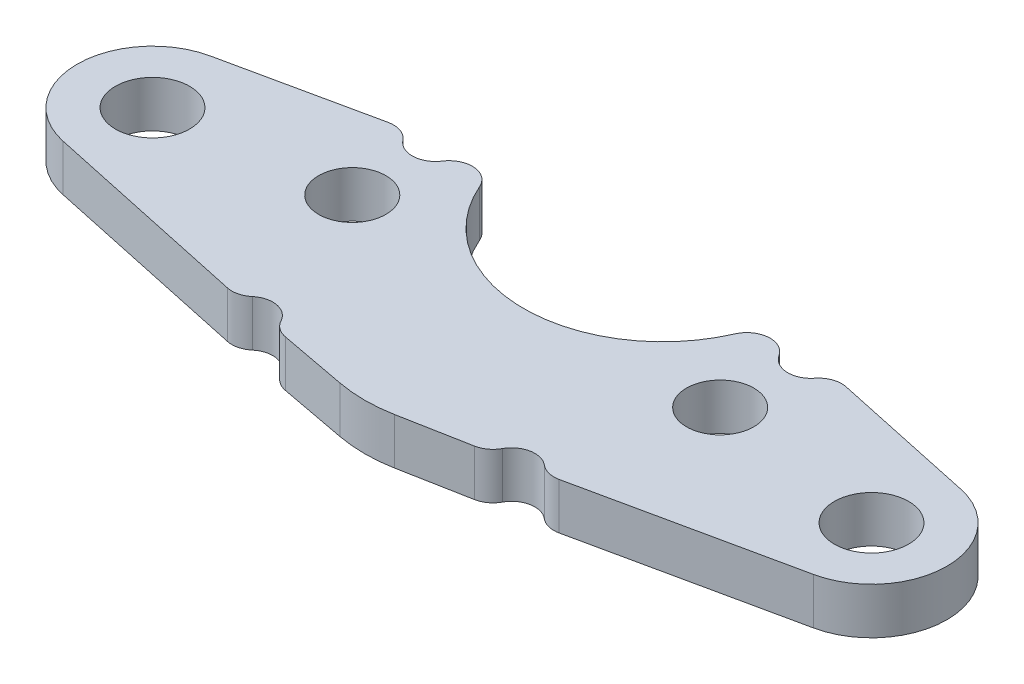
ISO-10303-21;
HEADER;
FILE_DESCRIPTION(('STEP AP214'),'2;1');
FILE_NAME('part.step','',(''),(''),'','','');
FILE_SCHEMA(('AUTOMOTIVE_DESIGN { 1 0 10303 214 1 1 1 1 }'));
ENDSEC;
DATA;
#1=APPLICATION_CONTEXT('core data for automotive mechanical design processes');
#2=APPLICATION_PROTOCOL_DEFINITION('international standard','automotive_design',2000,#1);
#3=PRODUCT_CONTEXT('',#1,'mechanical');
#4=PRODUCT('Part','Part','',(#3));
#5=PRODUCT_RELATED_PRODUCT_CATEGORY('part','',(#4));
#6=PRODUCT_DEFINITION_FORMATION('','',#4);
#7=PRODUCT_DEFINITION_CONTEXT('part definition',#1,'design');
#8=PRODUCT_DEFINITION('design','',#6,#7);
#9=PRODUCT_DEFINITION_SHAPE('','',#8);
#10=(LENGTH_UNIT() NAMED_UNIT(*) SI_UNIT(.MILLI.,.METRE.));
#11=(NAMED_UNIT(*) PLANE_ANGLE_UNIT() SI_UNIT($,.RADIAN.));
#12=(NAMED_UNIT(*) SI_UNIT($,.STERADIAN.) SOLID_ANGLE_UNIT());
#13=UNCERTAINTY_MEASURE_WITH_UNIT(LENGTH_MEASURE(1.E-05),#10,'distance_accuracy_value','');
#14=(GEOMETRIC_REPRESENTATION_CONTEXT(3) GLOBAL_UNCERTAINTY_ASSIGNED_CONTEXT((#13)) GLOBAL_UNIT_ASSIGNED_CONTEXT((#10,
#11,#12)) REPRESENTATION_CONTEXT('',''));
#15=CARTESIAN_POINT('',(0.,0.,0.));
#16=DIRECTION('',(0.,0.,1.));
#17=DIRECTION('',(1.,0.,0.));
#18=AXIS2_PLACEMENT_3D('',#15,#16,#17);
#19=CARTESIAN_POINT('',(-9.66319017523278,2.,-3.55276174849711));
#20=DIRECTION('',(0.,-1.,0.));
#21=DIRECTION('',(0.,0.,-1.));
#22=AXIS2_PLACEMENT_3D('',#19,#20,#21);
#23=CYLINDRICAL_SURFACE('',#22,0.999999998996763);
#24=CARTESIAN_POINT('',(-9.66319017523278,0.,-3.55276174849711));
#25=DIRECTION('',(0.,-1.,0.));
#26=DIRECTION('',(0.,0.,-1.));
#27=AXIS2_PLACEMENT_3D('',#24,#25,#26);
#28=CIRCLE('',#27,0.999999998996763);
#29=CARTESIAN_POINT('',(-9.87285832373124,0.,-4.53053435268418));
#30=VERTEX_POINT('',#29);
#31=CARTESIAN_POINT('',(-8.88026757956637,0.,-4.17488087470085));
#32=VERTEX_POINT('',#31);
#33=EDGE_CURVE('E216',#30,#32,#28,.T.);
#34=ORIENTED_EDGE('',*,*,#33,.F.);
#35=DIRECTION('',(0.,-1.,0.));
#36=VECTOR('',#35,1.);
#37=CARTESIAN_POINT('',(-9.87285832373124,2.,-4.53053435268418));
#38=LINE('',#37,#36);
#39=CARTESIAN_POINT('',(-9.87285832373124,2.,-4.53053435268418));
#40=VERTEX_POINT('',#39);
#41=EDGE_CURVE('E11',#40,#30,#38,.T.);
#42=ORIENTED_EDGE('',*,*,#41,.F.);
#43=CARTESIAN_POINT('',(-9.66319017523278,2.,-3.55276174849711));
#44=DIRECTION('',(0.,-1.,0.));
#45=DIRECTION('',(0.,0.,-1.));
#46=AXIS2_PLACEMENT_3D('',#43,#44,#45);
#47=CIRCLE('',#46,0.999999998996763);
#48=CARTESIAN_POINT('',(-8.88026757956637,2.,-4.17488087470085));
#49=VERTEX_POINT('',#48);
#50=EDGE_CURVE('E279',#40,#49,#47,.T.);
#51=ORIENTED_EDGE('',*,*,#50,.T.);
#52=DIRECTION('',(0.,-1.,0.));
#53=VECTOR('',#52,1.);
#54=CARTESIAN_POINT('',(-8.88026757956637,2.,-4.17488087470085));
#55=LINE('',#54,#53);
#56=EDGE_CURVE('E38',#49,#32,#55,.T.);
#57=ORIENTED_EDGE('',*,*,#56,.T.);
#58=EDGE_LOOP('',(#34,#42,#51,#57));
#59=FACE_BOUND('',#58,.T.);
#60=ADVANCED_FACE('F35',(#59),#23,.T.);
#61=CARTESIAN_POINT('',(-16.1814214831027,2.,-3.17776096585901));
#62=DIRECTION('',(-0.209668148708805,0.,-0.977772605168002));
#63=DIRECTION('',(-0.977772605168003,0.,0.209668148708805));
#64=AXIS2_PLACEMENT_3D('',#61,#62,#63);
#65=PLANE('',#64);
#66=DIRECTION('',(0.977772605168002,0.,-0.209668148708805));
#67=VECTOR('',#66,1.);
#68=CARTESIAN_POINT('',(-16.1814214831027,0.,-3.17776096585901));
#69=LINE('',#68,#67);
#70=CARTESIAN_POINT('',(-16.1814214831027,0.,-3.17776096585901));
#71=VERTEX_POINT('',#70);
#72=EDGE_CURVE('E277',#71,#30,#69,.T.);
#73=ORIENTED_EDGE('',*,*,#72,.F.);
#74=DIRECTION('',(0.,-1.,0.));
#75=VECTOR('',#74,1.);
#76=CARTESIAN_POINT('',(-16.1814214831027,2.,-3.17776096585901));
#77=LINE('',#76,#75);
#78=CARTESIAN_POINT('',(-16.1814214831027,2.,-3.17776096585901));
#79=VERTEX_POINT('',#78);
#80=EDGE_CURVE('E44',#79,#71,#77,.T.);
#81=ORIENTED_EDGE('',*,*,#80,.F.);
#82=DIRECTION('',(0.977772605168002,0.,-0.209668148708805));
#83=VECTOR('',#82,1.);
#84=CARTESIAN_POINT('',(-16.1814214831027,2.,-3.17776096585901));
#85=LINE('',#84,#83);
#86=EDGE_CURVE('E206',#79,#40,#85,.T.);
#87=ORIENTED_EDGE('',*,*,#86,.T.);
#88=ORIENTED_EDGE('',*,*,#41,.T.);
#89=EDGE_LOOP('',(#73,#81,#87,#88));
#90=FACE_BOUND('',#89,.T.);
#91=ADVANCED_FACE('F319',(#90),#65,.T.);
#92=CARTESIAN_POINT('',(-15.5,2.,0.));
#93=DIRECTION('',(0.,-1.,0.));
#94=DIRECTION('',(0.,0.,-1.));
#95=AXIS2_PLACEMENT_3D('',#92,#93,#94);
#96=CYLINDRICAL_SURFACE('',#95,3.2499999990417);
#97=CARTESIAN_POINT('',(-15.5,0.,0.));
#98=DIRECTION('',(0.,-1.,0.));
#99=DIRECTION('',(0.,0.,-1.));
#100=AXIS2_PLACEMENT_3D('',#97,#98,#99);
#101=CIRCLE('',#100,3.2499999990417);
#102=CARTESIAN_POINT('',(-16.1814214831027,0.,3.17776096585901));
#103=VERTEX_POINT('',#102);
#104=EDGE_CURVE('E193',#103,#71,#101,.T.);
#105=ORIENTED_EDGE('',*,*,#104,.F.);
#106=DIRECTION('',(0.,-1.,0.));
#107=VECTOR('',#106,1.);
#108=CARTESIAN_POINT('',(-16.1814214831027,2.,3.17776096585901));
#109=LINE('',#108,#107);
#110=CARTESIAN_POINT('',(-16.1814214831027,2.,3.17776096585901));
#111=VERTEX_POINT('',#110);
#112=EDGE_CURVE('E188',#111,#103,#109,.T.);
#113=ORIENTED_EDGE('',*,*,#112,.F.);
#114=CARTESIAN_POINT('',(-15.5,2.,0.));
#115=DIRECTION('',(0.,-1.,0.));
#116=DIRECTION('',(0.,0.,-1.));
#117=AXIS2_PLACEMENT_3D('',#114,#115,#116);
#118=CIRCLE('',#117,3.2499999990417);
#119=EDGE_CURVE('E191',#111,#79,#118,.T.);
#120=ORIENTED_EDGE('',*,*,#119,.T.);
#121=ORIENTED_EDGE('',*,*,#80,.T.);
#122=EDGE_LOOP('',(#105,#113,#120,#121));
#123=FACE_BOUND('',#122,.T.);
#124=ADVANCED_FACE('F190',(#123),#96,.T.);
#125=CARTESIAN_POINT('',(-7.15068108627514,2.,5.11426298122006));
#126=DIRECTION('',(-0.209668148708806,0.,0.977772605168002));
#127=DIRECTION('',(0.977772605168002,0.,0.209668148708806));
#128=AXIS2_PLACEMENT_3D('',#125,#126,#127);
#129=PLANE('',#128);
#130=DIRECTION('',(-0.977772605168002,0.,-0.209668148708806));
#131=VECTOR('',#130,1.);
#132=CARTESIAN_POINT('',(-7.15068108627514,0.,5.11426298122006));
#133=LINE('',#132,#131);
#134=CARTESIAN_POINT('',(-7.15068108627514,0.,5.11426298122006));
#135=VERTEX_POINT('',#134);
#136=EDGE_CURVE('E274',#135,#103,#133,.T.);
#137=ORIENTED_EDGE('',*,*,#136,.F.);
#138=DIRECTION('',(0.,-1.,0.));
#139=VECTOR('',#138,1.);
#140=CARTESIAN_POINT('',(-7.15068108627514,2.,5.11426298122006));
#141=LINE('',#140,#139);
#142=CARTESIAN_POINT('',(-7.15068108627514,2.,5.11426298122006));
#143=VERTEX_POINT('',#142);
#144=EDGE_CURVE('E198',#143,#135,#141,.T.);
#145=ORIENTED_EDGE('',*,*,#144,.F.);
#146=DIRECTION('',(-0.977772605168002,0.,-0.209668148708806));
#147=VECTOR('',#146,1.);
#148=CARTESIAN_POINT('',(-7.15068108627514,2.,5.11426298122006));
#149=LINE('',#148,#147);
#150=EDGE_CURVE('E204',#143,#111,#149,.T.);
#151=ORIENTED_EDGE('',*,*,#150,.T.);
#152=ORIENTED_EDGE('',*,*,#112,.T.);
#153=EDGE_LOOP('',(#137,#145,#151,#152));
#154=FACE_BOUND('',#153,.T.);
#155=ADVANCED_FACE('F208',(#154),#129,.T.);
#156=CARTESIAN_POINT('',(-6.9410129377771,2.,4.13649037703447));
#157=DIRECTION('',(0.,-1.,0.));
#158=DIRECTION('',(0.,0.,-1.));
#159=AXIS2_PLACEMENT_3D('',#156,#157,#158);
#160=CYLINDRICAL_SURFACE('',#159,0.999999998995239);
#161=CARTESIAN_POINT('',(-6.9410129377771,0.,4.13649037703447));
#162=DIRECTION('',(0.,-1.,0.));
#163=DIRECTION('',(0.,0.,-1.));
#164=AXIS2_PLACEMENT_3D('',#161,#162,#163);
#165=CIRCLE('',#164,0.999999998995239);
#166=CARTESIAN_POINT('',(-6.29550648155961,0.,4.90024518911228));
#167=VERTEX_POINT('',#166);
#168=EDGE_CURVE('E271',#167,#135,#165,.T.);
#169=ORIENTED_EDGE('',*,*,#168,.F.);
#170=DIRECTION('',(0.,-1.,0.));
#171=VECTOR('',#170,1.);
#172=CARTESIAN_POINT('',(-6.29550648155961,2.,4.90024518911228));
#173=LINE('',#172,#171);
#174=CARTESIAN_POINT('',(-6.29550648155961,2.,4.90024518911228));
#175=VERTEX_POINT('',#174);
#176=EDGE_CURVE('E283',#175,#167,#173,.T.);
#177=ORIENTED_EDGE('',*,*,#176,.F.);
#178=CARTESIAN_POINT('',(-6.9410129377771,2.,4.13649037703447));
#179=DIRECTION('',(0.,-1.,0.));
#180=DIRECTION('',(0.,0.,-1.));
#181=AXIS2_PLACEMENT_3D('',#178,#179,#180);
#182=CIRCLE('',#181,0.999999998995239);
#183=EDGE_CURVE('E209',#175,#143,#182,.T.);
#184=ORIENTED_EDGE('',*,*,#183,.T.);
#185=ORIENTED_EDGE('',*,*,#144,.T.);
#186=EDGE_LOOP('',(#169,#177,#184,#185));
#187=FACE_BOUND('',#186,.T.);
#188=ADVANCED_FACE('F332',(#187),#160,.T.);
#189=CARTESIAN_POINT('',(-5.65000002534211,2.,5.66400000119011));
#190=DIRECTION('',(0.,-1.,0.));
#191=DIRECTION('',(0.,0.,-1.));
#192=AXIS2_PLACEMENT_3D('',#189,#190,#191);
#193=CYLINDRICAL_SURFACE('',#192,0.999999998995248);
#194=CARTESIAN_POINT('',(-5.65000002534211,0.,5.66400000119011));
#195=DIRECTION('',(0.,1.,0.));
#196=DIRECTION('',(0.,0.,1.));
#197=AXIS2_PLACEMENT_3D('',#194,#195,#196);
#198=CIRCLE('',#197,0.999999998995248);
#199=CARTESIAN_POINT('',(-4.77092809513098,0.,5.18731085771673));
#200=VERTEX_POINT('',#199);
#201=EDGE_CURVE('E268',#200,#167,#198,.T.);
#202=ORIENTED_EDGE('',*,*,#201,.F.);
#203=DIRECTION('',(0.,-1.,0.));
#204=VECTOR('',#203,1.);
#205=CARTESIAN_POINT('',(-4.77092809513098,2.,5.18731085771673));
#206=LINE('',#205,#204);
#207=CARTESIAN_POINT('',(-4.77092809513098,2.,5.18731085771673));
#208=VERTEX_POINT('',#207);
#209=EDGE_CURVE('E285',#208,#200,#206,.T.);
#210=ORIENTED_EDGE('',*,*,#209,.F.);
#211=CARTESIAN_POINT('',(-5.65000002534211,2.,5.66400000119011));
#212=DIRECTION('',(0.,1.,0.));
#213=DIRECTION('',(0.,0.,1.));
#214=AXIS2_PLACEMENT_3D('',#211,#212,#213);
#215=CIRCLE('',#214,0.999999998995248);
#216=EDGE_CURVE('E211',#208,#175,#215,.T.);
#217=ORIENTED_EDGE('',*,*,#216,.T.);
#218=ORIENTED_EDGE('',*,*,#176,.T.);
#219=EDGE_LOOP('',(#202,#210,#217,#218));
#220=FACE_BOUND('',#219,.T.);
#221=ADVANCED_FACE('F335',(#220),#193,.F.);
#222=CARTESIAN_POINT('',(-3.89185616491986,2.,4.71062171424335));
#223=DIRECTION('',(0.,-1.,0.));
#224=DIRECTION('',(0.,0.,-1.));
#225=AXIS2_PLACEMENT_3D('',#222,#223,#224);
#226=CYLINDRICAL_SURFACE('',#225,0.999999998995249);
#227=CARTESIAN_POINT('',(-3.89185616491986,0.,4.71062171424335));
#228=DIRECTION('',(0.,-1.,0.));
#229=DIRECTION('',(0.,0.,-1.));
#230=AXIS2_PLACEMENT_3D('',#227,#228,#229);
#231=CIRCLE('',#230,0.999999998995249);
#232=CARTESIAN_POINT('',(-4.07689638301942,0.,5.69335266199872));
#233=VERTEX_POINT('',#232);
#234=EDGE_CURVE('E265',#233,#200,#231,.T.);
#235=ORIENTED_EDGE('',*,*,#234,.F.);
#236=DIRECTION('',(0.,-1.,0.));
#237=VECTOR('',#236,1.);
#238=CARTESIAN_POINT('',(-4.07689638301942,2.,5.69335266199872));
#239=LINE('',#238,#237);
#240=CARTESIAN_POINT('',(-4.07689638301942,2.,5.69335266199872));
#241=VERTEX_POINT('',#240);
#242=EDGE_CURVE('E287',#241,#233,#239,.T.);
#243=ORIENTED_EDGE('',*,*,#242,.F.);
#244=CARTESIAN_POINT('',(-3.89185616491986,2.,4.71062171424335));
#245=DIRECTION('',(0.,-1.,0.));
#246=DIRECTION('',(0.,0.,-1.));
#247=AXIS2_PLACEMENT_3D('',#244,#245,#246);
#248=CIRCLE('',#247,0.999999998995249);
#249=EDGE_CURVE('E499',#241,#208,#248,.T.);
#250=ORIENTED_EDGE('',*,*,#249,.T.);
#251=ORIENTED_EDGE('',*,*,#209,.T.);
#252=EDGE_LOOP('',(#235,#243,#250,#251));
#253=FACE_BOUND('',#252,.T.);
#254=ADVANCED_FACE('F339',(#253),#226,.T.);
#255=CARTESIAN_POINT('',(-1.17489873997683,2.,6.23977513706122));
#256=DIRECTION('',(-0.185040218285478,0.,0.982730948742769));
#257=DIRECTION('',(0.982730948742769,0.,0.185040218285478));
#258=AXIS2_PLACEMENT_3D('',#255,#256,#257);
#259=PLANE('',#258);
#260=DIRECTION('',(-0.982730948742769,0.,-0.185040218285478));
#261=VECTOR('',#260,1.);
#262=CARTESIAN_POINT('',(-1.17489873997683,0.,6.23977513706122));
#263=LINE('',#262,#261);
#264=CARTESIAN_POINT('',(-1.17489873997683,0.,6.23977513706122));
#265=VERTEX_POINT('',#264);
#266=EDGE_CURVE('E262',#265,#233,#263,.T.);
#267=ORIENTED_EDGE('',*,*,#266,.F.);
#268=DIRECTION('',(0.,-1.,0.));
#269=VECTOR('',#268,1.);
#270=CARTESIAN_POINT('',(-1.17489873997683,2.,6.23977513706122));
#271=LINE('',#270,#269);
#272=CARTESIAN_POINT('',(-1.17489873997683,2.,6.23977513706122));
#273=VERTEX_POINT('',#272);
#274=EDGE_CURVE('E289',#273,#265,#271,.T.);
#275=ORIENTED_EDGE('',*,*,#274,.F.);
#276=DIRECTION('',(-0.982730948742769,0.,-0.185040218285478));
#277=VECTOR('',#276,1.);
#278=CARTESIAN_POINT('',(-1.17489873997683,2.,6.23977513706122));
#279=LINE('',#278,#277);
#280=EDGE_CURVE('E496',#273,#241,#279,.T.);
#281=ORIENTED_EDGE('',*,*,#280,.T.);
#282=ORIENTED_EDGE('',*,*,#242,.T.);
#283=EDGE_LOOP('',(#267,#275,#281,#282));
#284=FACE_BOUND('',#283,.T.);
#285=ADVANCED_FACE('F343',(#284),#259,.T.);
#286=CARTESIAN_POINT('',(0.,2.,0.));
#287=DIRECTION('',(0.,-1.,0.));
#288=DIRECTION('',(0.,0.,-1.));
#289=AXIS2_PLACEMENT_3D('',#286,#287,#288);
#290=CYLINDRICAL_SURFACE('',#289,6.34942365969436);
#291=CARTESIAN_POINT('',(0.,0.,0.));
#292=DIRECTION('',(0.,-1.,0.));
#293=DIRECTION('',(0.,0.,-1.));
#294=AXIS2_PLACEMENT_3D('',#291,#292,#293);
#295=CIRCLE('',#294,6.34942365969436);
#296=CARTESIAN_POINT('',(1.17489873997683,0.,6.23977513706122));
#297=VERTEX_POINT('',#296);
#298=EDGE_CURVE('E259',#297,#265,#295,.T.);
#299=ORIENTED_EDGE('',*,*,#298,.F.);
#300=DIRECTION('',(0.,-1.,0.));
#301=VECTOR('',#300,1.);
#302=CARTESIAN_POINT('',(1.17489873997683,2.,6.23977513706122));
#303=LINE('',#302,#301);
#304=CARTESIAN_POINT('',(1.17489873997683,2.,6.23977513706122));
#305=VERTEX_POINT('',#304);
#306=EDGE_CURVE('E291',#305,#297,#303,.T.);
#307=ORIENTED_EDGE('',*,*,#306,.F.);
#308=CARTESIAN_POINT('',(0.,2.,0.));
#309=DIRECTION('',(0.,-1.,0.));
#310=DIRECTION('',(0.,0.,-1.));
#311=AXIS2_PLACEMENT_3D('',#308,#309,#310);
#312=CIRCLE('',#311,6.34942365969436);
#313=EDGE_CURVE('E493',#305,#273,#312,.T.);
#314=ORIENTED_EDGE('',*,*,#313,.T.);
#315=ORIENTED_EDGE('',*,*,#274,.T.);
#316=EDGE_LOOP('',(#299,#307,#314,#315));
#317=FACE_BOUND('',#316,.T.);
#318=ADVANCED_FACE('F347',(#317),#290,.T.);
#319=CARTESIAN_POINT('',(1.17489873997683,2.,6.23977513706122));
#320=DIRECTION('',(0.185040218285478,0.,0.982730948742769));
#321=DIRECTION('',(0.982730948742769,0.,-0.185040218285478));
#322=AXIS2_PLACEMENT_3D('',#319,#320,#321);
#323=PLANE('',#322);
#324=DIRECTION('',(-0.982730948742769,0.,0.185040218285478));
#325=VECTOR('',#324,1.);
#326=CARTESIAN_POINT('',(1.17489873997683,0.,6.23977513706122));
#327=LINE('',#326,#325);
#328=CARTESIAN_POINT('',(4.07689638301942,0.,5.69335266199872));
#329=VERTEX_POINT('',#328);
#330=EDGE_CURVE('E256',#329,#297,#327,.T.);
#331=ORIENTED_EDGE('',*,*,#330,.F.);
#332=DIRECTION('',(0.,-1.,0.));
#333=VECTOR('',#332,1.);
#334=CARTESIAN_POINT('',(4.07689638301942,2.,5.69335266199872));
#335=LINE('',#334,#333);
#336=CARTESIAN_POINT('',(4.07689638301942,2.,5.69335266199872));
#337=VERTEX_POINT('',#336);
#338=EDGE_CURVE('E293',#337,#329,#335,.T.);
#339=ORIENTED_EDGE('',*,*,#338,.F.);
#340=DIRECTION('',(-0.982730948742769,0.,0.185040218285478));
#341=VECTOR('',#340,1.);
#342=CARTESIAN_POINT('',(1.17489873997683,2.,6.23977513706122));
#343=LINE('',#342,#341);
#344=EDGE_CURVE('E490',#337,#305,#343,.T.);
#345=ORIENTED_EDGE('',*,*,#344,.T.);
#346=ORIENTED_EDGE('',*,*,#306,.T.);
#347=EDGE_LOOP('',(#331,#339,#345,#346));
#348=FACE_BOUND('',#347,.T.);
#349=ADVANCED_FACE('F351',(#348),#323,.T.);
#350=CARTESIAN_POINT('',(3.89185616491986,2.,4.71062171424335));
#351=DIRECTION('',(0.,-1.,0.));
#352=DIRECTION('',(0.,0.,-1.));
#353=AXIS2_PLACEMENT_3D('',#350,#351,#352);
#354=CYLINDRICAL_SURFACE('',#353,0.999999998995249);
#355=CARTESIAN_POINT('',(3.89185616491986,0.,4.71062171424335));
#356=DIRECTION('',(0.,-1.,0.));
#357=DIRECTION('',(0.,0.,1.));
#358=AXIS2_PLACEMENT_3D('',#355,#356,#357);
#359=CIRCLE('',#358,0.999999998995249);
#360=CARTESIAN_POINT('',(4.77092809513098,0.,5.18731085771673));
#361=VERTEX_POINT('',#360);
#362=EDGE_CURVE('E253',#361,#329,#359,.T.);
#363=ORIENTED_EDGE('',*,*,#362,.F.);
#364=DIRECTION('',(0.,-1.,0.));
#365=VECTOR('',#364,1.);
#366=CARTESIAN_POINT('',(4.77092809513098,2.,5.18731085771673));
#367=LINE('',#366,#365);
#368=CARTESIAN_POINT('',(4.77092809513098,2.,5.18731085771673));
#369=VERTEX_POINT('',#368);
#370=EDGE_CURVE('E295',#369,#361,#367,.T.);
#371=ORIENTED_EDGE('',*,*,#370,.F.);
#372=CARTESIAN_POINT('',(3.89185616491986,2.,4.71062171424335));
#373=DIRECTION('',(0.,-1.,0.));
#374=DIRECTION('',(0.,0.,1.));
#375=AXIS2_PLACEMENT_3D('',#372,#373,#374);
#376=CIRCLE('',#375,0.999999998995249);
#377=EDGE_CURVE('E487',#369,#337,#376,.T.);
#378=ORIENTED_EDGE('',*,*,#377,.T.);
#379=ORIENTED_EDGE('',*,*,#338,.T.);
#380=EDGE_LOOP('',(#363,#371,#378,#379));
#381=FACE_BOUND('',#380,.T.);
#382=ADVANCED_FACE('F355',(#381),#354,.T.);
#383=CARTESIAN_POINT('',(5.65000002534211,2.,5.66400000119011));
#384=DIRECTION('',(0.,-1.,0.));
#385=DIRECTION('',(0.,0.,-1.));
#386=AXIS2_PLACEMENT_3D('',#383,#384,#385);
#387=CYLINDRICAL_SURFACE('',#386,0.999999998995248);
#388=CARTESIAN_POINT('',(5.65000002534211,0.,5.66400000119011));
#389=DIRECTION('',(0.,1.,0.));
#390=DIRECTION('',(0.,0.,-1.));
#391=AXIS2_PLACEMENT_3D('',#388,#389,#390);
#392=CIRCLE('',#391,0.999999998995248);
#393=CARTESIAN_POINT('',(6.2955064815596,0.,4.90024518911229));
#394=VERTEX_POINT('',#393);
#395=EDGE_CURVE('E250',#394,#361,#392,.T.);
#396=ORIENTED_EDGE('',*,*,#395,.F.);
#397=DIRECTION('',(0.,-1.,0.));
#398=VECTOR('',#397,1.);
#399=CARTESIAN_POINT('',(6.2955064815596,2.,4.90024518911229));
#400=LINE('',#399,#398);
#401=CARTESIAN_POINT('',(6.2955064815596,2.,4.90024518911229));
#402=VERTEX_POINT('',#401);
#403=EDGE_CURVE('E297',#402,#394,#400,.T.);
#404=ORIENTED_EDGE('',*,*,#403,.F.);
#405=CARTESIAN_POINT('',(5.65000002534211,2.,5.66400000119011));
#406=DIRECTION('',(0.,1.,0.));
#407=DIRECTION('',(0.,0.,-1.));
#408=AXIS2_PLACEMENT_3D('',#405,#406,#407);
#409=CIRCLE('',#408,0.999999998995248);
#410=EDGE_CURVE('E484',#402,#369,#409,.T.);
#411=ORIENTED_EDGE('',*,*,#410,.T.);
#412=ORIENTED_EDGE('',*,*,#370,.T.);
#413=EDGE_LOOP('',(#396,#404,#411,#412));
#414=FACE_BOUND('',#413,.T.);
#415=ADVANCED_FACE('F359',(#414),#387,.F.);
#416=CARTESIAN_POINT('',(6.9410129377771,2.,4.13649037703447));
#417=DIRECTION('',(0.,-1.,0.));
#418=DIRECTION('',(0.,0.,-1.));
#419=AXIS2_PLACEMENT_3D('',#416,#417,#418);
#420=CYLINDRICAL_SURFACE('',#419,0.999999998995239);
#421=CARTESIAN_POINT('',(6.9410129377771,0.,4.13649037703447));
#422=DIRECTION('',(0.,-1.,0.));
#423=DIRECTION('',(0.,0.,1.));
#424=AXIS2_PLACEMENT_3D('',#421,#422,#423);
#425=CIRCLE('',#424,0.999999998995239);
#426=CARTESIAN_POINT('',(7.15068108627514,0.,5.11426298122007));
#427=VERTEX_POINT('',#426);
#428=EDGE_CURVE('E247',#427,#394,#425,.T.);
#429=ORIENTED_EDGE('',*,*,#428,.F.);
#430=DIRECTION('',(0.,-1.,0.));
#431=VECTOR('',#430,1.);
#432=CARTESIAN_POINT('',(7.15068108627514,2.,5.11426298122007));
#433=LINE('',#432,#431);
#434=CARTESIAN_POINT('',(7.15068108627514,2.,5.11426298122007));
#435=VERTEX_POINT('',#434);
#436=EDGE_CURVE('E299',#435,#427,#433,.T.);
#437=ORIENTED_EDGE('',*,*,#436,.F.);
#438=CARTESIAN_POINT('',(6.9410129377771,2.,4.13649037703447));
#439=DIRECTION('',(0.,-1.,0.));
#440=DIRECTION('',(0.,0.,1.));
#441=AXIS2_PLACEMENT_3D('',#438,#439,#440);
#442=CIRCLE('',#441,0.999999998995239);
#443=EDGE_CURVE('E481',#435,#402,#442,.T.);
#444=ORIENTED_EDGE('',*,*,#443,.T.);
#445=ORIENTED_EDGE('',*,*,#403,.T.);
#446=EDGE_LOOP('',(#429,#437,#444,#445));
#447=FACE_BOUND('',#446,.T.);
#448=ADVANCED_FACE('F363',(#447),#420,.T.);
#449=CARTESIAN_POINT('',(7.15068108627514,2.,5.11426298122006));
#450=DIRECTION('',(0.209668148708806,0.,0.977772605168002));
#451=DIRECTION('',(0.977772605168002,0.,-0.209668148708806));
#452=AXIS2_PLACEMENT_3D('',#449,#450,#451);
#453=PLANE('',#452);
#454=DIRECTION('',(-0.977772605168002,0.,0.209668148708806));
#455=VECTOR('',#454,1.);
#456=CARTESIAN_POINT('',(7.15068108627514,0.,5.11426298122006));
#457=LINE('',#456,#455);
#458=CARTESIAN_POINT('',(16.1814214831027,0.,3.17776096585901));
#459=VERTEX_POINT('',#458);
#460=EDGE_CURVE('E244',#459,#427,#457,.T.);
#461=ORIENTED_EDGE('',*,*,#460,.F.);
#462=DIRECTION('',(0.,-1.,0.));
#463=VECTOR('',#462,1.);
#464=CARTESIAN_POINT('',(16.1814214831027,2.,3.17776096585901));
#465=LINE('',#464,#463);
#466=CARTESIAN_POINT('',(16.1814214831027,2.,3.17776096585901));
#467=VERTEX_POINT('',#466);
#468=EDGE_CURVE('E301',#467,#459,#465,.T.);
#469=ORIENTED_EDGE('',*,*,#468,.F.);
#470=DIRECTION('',(-0.977772605168002,0.,0.209668148708806));
#471=VECTOR('',#470,1.);
#472=CARTESIAN_POINT('',(7.15068108627514,2.,5.11426298122006));
#473=LINE('',#472,#471);
#474=EDGE_CURVE('E478',#467,#435,#473,.T.);
#475=ORIENTED_EDGE('',*,*,#474,.T.);
#476=ORIENTED_EDGE('',*,*,#436,.T.);
#477=EDGE_LOOP('',(#461,#469,#475,#476));
#478=FACE_BOUND('',#477,.T.);
#479=ADVANCED_FACE('F367',(#478),#453,.T.);
#480=CARTESIAN_POINT('',(15.5,2.,0.));
#481=DIRECTION('',(0.,-1.,0.));
#482=DIRECTION('',(0.,0.,-1.));
#483=AXIS2_PLACEMENT_3D('',#480,#481,#482);
#484=CYLINDRICAL_SURFACE('',#483,3.2499999990417);
#485=CARTESIAN_POINT('',(15.5,0.,0.));
#486=DIRECTION('',(0.,-1.,0.));
#487=DIRECTION('',(0.,0.,1.));
#488=AXIS2_PLACEMENT_3D('',#485,#486,#487);
#489=CIRCLE('',#488,3.2499999990417);
#490=CARTESIAN_POINT('',(16.1814214831027,0.,-3.17776096585901));
#491=VERTEX_POINT('',#490);
#492=EDGE_CURVE('E241',#491,#459,#489,.T.);
#493=ORIENTED_EDGE('',*,*,#492,.F.);
#494=DIRECTION('',(0.,-1.,0.));
#495=VECTOR('',#494,1.);
#496=CARTESIAN_POINT('',(16.1814214831027,2.,-3.17776096585901));
#497=LINE('',#496,#495);
#498=CARTESIAN_POINT('',(16.1814214831027,2.,-3.17776096585901));
#499=VERTEX_POINT('',#498);
#500=EDGE_CURVE('E303',#499,#491,#497,.T.);
#501=ORIENTED_EDGE('',*,*,#500,.F.);
#502=CARTESIAN_POINT('',(15.5,2.,0.));
#503=DIRECTION('',(0.,-1.,0.));
#504=DIRECTION('',(0.,0.,1.));
#505=AXIS2_PLACEMENT_3D('',#502,#503,#504);
#506=CIRCLE('',#505,3.2499999990417);
#507=EDGE_CURVE('E475',#499,#467,#506,.T.);
#508=ORIENTED_EDGE('',*,*,#507,.T.);
#509=ORIENTED_EDGE('',*,*,#468,.T.);
#510=EDGE_LOOP('',(#493,#501,#508,#509));
#511=FACE_BOUND('',#510,.T.);
#512=ADVANCED_FACE('F371',(#511),#484,.T.);
#513=CARTESIAN_POINT('',(16.1814214831027,2.,-3.17776096585901));
#514=DIRECTION('',(0.209668148708805,0.,-0.977772605168002));
#515=DIRECTION('',(-0.977772605168003,0.,-0.209668148708805));
#516=AXIS2_PLACEMENT_3D('',#513,#514,#515);
#517=PLANE('',#516);
#518=DIRECTION('',(0.977772605168002,0.,0.209668148708805));
#519=VECTOR('',#518,1.);
#520=CARTESIAN_POINT('',(16.1814214831027,0.,-3.17776096585901));
#521=LINE('',#520,#519);
#522=CARTESIAN_POINT('',(9.87285832373124,0.,-4.53053435268418));
#523=VERTEX_POINT('',#522);
#524=EDGE_CURVE('E238',#523,#491,#521,.T.);
#525=ORIENTED_EDGE('',*,*,#524,.F.);
#526=DIRECTION('',(0.,-1.,0.));
#527=VECTOR('',#526,1.);
#528=CARTESIAN_POINT('',(9.87285832373124,2.,-4.53053435268418));
#529=LINE('',#528,#527);
#530=CARTESIAN_POINT('',(9.87285832373124,2.,-4.53053435268418));
#531=VERTEX_POINT('',#530);
#532=EDGE_CURVE('E305',#531,#523,#529,.T.);
#533=ORIENTED_EDGE('',*,*,#532,.F.);
#534=DIRECTION('',(0.977772605168002,0.,0.209668148708805));
#535=VECTOR('',#534,1.);
#536=CARTESIAN_POINT('',(16.1814214831027,2.,-3.17776096585901));
#537=LINE('',#536,#535);
#538=EDGE_CURVE('E472',#531,#499,#537,.T.);
#539=ORIENTED_EDGE('',*,*,#538,.T.);
#540=ORIENTED_EDGE('',*,*,#500,.T.);
#541=EDGE_LOOP('',(#525,#533,#539,#540));
#542=FACE_BOUND('',#541,.T.);
#543=ADVANCED_FACE('F375',(#542),#517,.T.);
#544=CARTESIAN_POINT('',(9.66319017523278,2.,-3.55276174849711));
#545=DIRECTION('',(0.,-1.,0.));
#546=DIRECTION('',(0.,0.,-1.));
#547=AXIS2_PLACEMENT_3D('',#544,#545,#546);
#548=CYLINDRICAL_SURFACE('',#547,0.999999998996763);
#549=CARTESIAN_POINT('',(9.66319017523278,0.,-3.55276174849711));
#550=DIRECTION('',(0.,-1.,0.));
#551=DIRECTION('',(0.,0.,1.));
#552=AXIS2_PLACEMENT_3D('',#549,#550,#551);
#553=CIRCLE('',#552,0.999999998996763);
#554=CARTESIAN_POINT('',(8.88026757956637,0.,-4.17488087470085));
#555=VERTEX_POINT('',#554);
#556=EDGE_CURVE('E235',#555,#523,#553,.T.);
#557=ORIENTED_EDGE('',*,*,#556,.F.);
#558=DIRECTION('',(0.,-1.,0.));
#559=VECTOR('',#558,1.);
#560=CARTESIAN_POINT('',(8.88026757956637,2.,-4.17488087470085));
#561=LINE('',#560,#559);
#562=CARTESIAN_POINT('',(8.88026757956637,2.,-4.17488087470085));
#563=VERTEX_POINT('',#562);
#564=EDGE_CURVE('E307',#563,#555,#561,.T.);
#565=ORIENTED_EDGE('',*,*,#564,.F.);
#566=CARTESIAN_POINT('',(9.66319017523278,2.,-3.55276174849711));
#567=DIRECTION('',(0.,-1.,0.));
#568=DIRECTION('',(0.,0.,1.));
#569=AXIS2_PLACEMENT_3D('',#566,#567,#568);
#570=CIRCLE('',#569,0.999999998996763);
#571=EDGE_CURVE('E469',#563,#531,#570,.T.);
#572=ORIENTED_EDGE('',*,*,#571,.T.);
#573=ORIENTED_EDGE('',*,*,#532,.T.);
#574=EDGE_LOOP('',(#557,#565,#572,#573));
#575=FACE_BOUND('',#574,.T.);
#576=ADVANCED_FACE('F379',(#575),#548,.T.);
#577=CARTESIAN_POINT('',(8.09734498389996,2.,-4.79700000090459));
#578=DIRECTION('',(0.,-1.,0.));
#579=DIRECTION('',(0.,0.,-1.));
#580=AXIS2_PLACEMENT_3D('',#577,#578,#579);
#581=CYLINDRICAL_SURFACE('',#580,0.999999998996763);
#582=CARTESIAN_POINT('',(8.09734498389996,0.,-4.79700000090459));
#583=DIRECTION('',(0.,1.,0.));
#584=DIRECTION('',(0.,0.,-1.));
#585=AXIS2_PLACEMENT_3D('',#582,#583,#584);
#586=CIRCLE('',#585,0.999999998996763);
#587=CARTESIAN_POINT('',(7.2583650769999,0.,-4.25283760436153));
#588=VERTEX_POINT('',#587);
#589=EDGE_CURVE('E232',#588,#555,#586,.T.);
#590=ORIENTED_EDGE('',*,*,#589,.F.);
#591=DIRECTION('',(0.,-1.,0.));
#592=VECTOR('',#591,1.);
#593=CARTESIAN_POINT('',(7.2583650769999,2.,-4.25283760436153));
#594=LINE('',#593,#592);
#595=CARTESIAN_POINT('',(7.2583650769999,2.,-4.25283760436153));
#596=VERTEX_POINT('',#595);
#597=EDGE_CURVE('E309',#596,#588,#594,.T.);
#598=ORIENTED_EDGE('',*,*,#597,.F.);
#599=CARTESIAN_POINT('',(8.09734498389996,2.,-4.79700000090459));
#600=DIRECTION('',(0.,1.,0.));
#601=DIRECTION('',(0.,0.,-1.));
#602=AXIS2_PLACEMENT_3D('',#599,#600,#601);
#603=CIRCLE('',#602,0.999999998996763);
#604=EDGE_CURVE('E466',#596,#563,#603,.T.);
#605=ORIENTED_EDGE('',*,*,#604,.T.);
#606=ORIENTED_EDGE('',*,*,#564,.T.);
#607=EDGE_LOOP('',(#590,#598,#605,#606));
#608=FACE_BOUND('',#607,.T.);
#609=ADVANCED_FACE('F383',(#608),#581,.F.);
#610=CARTESIAN_POINT('',(6.41938517009983,2.,-3.70867520781847));
#611=DIRECTION('',(0.,-1.,0.));
#612=DIRECTION('',(0.,0.,-1.));
#613=AXIS2_PLACEMENT_3D('',#610,#611,#612);
#614=CYLINDRICAL_SURFACE('',#613,0.999999998996761);
#615=CARTESIAN_POINT('',(6.41938517009983,0.,-3.70867520781847));
#616=DIRECTION('',(0.,-1.,0.));
#617=DIRECTION('',(0.,0.,1.));
#618=AXIS2_PLACEMENT_3D('',#615,#616,#617);
#619=CIRCLE('',#618,0.999999998996761);
#620=CARTESIAN_POINT('',(5.50233014743729,0.,-4.1074358921931));
#621=VERTEX_POINT('',#620);
#622=EDGE_CURVE('E229',#621,#588,#619,.T.);
#623=ORIENTED_EDGE('',*,*,#622,.F.);
#624=DIRECTION('',(0.,-1.,0.));
#625=VECTOR('',#624,1.);
#626=CARTESIAN_POINT('',(5.50233014743729,2.,-4.1074358921931));
#627=LINE('',#626,#625);
#628=CARTESIAN_POINT('',(5.50233014743729,2.,-4.1074358921931));
#629=VERTEX_POINT('',#628);
#630=EDGE_CURVE('E311',#629,#621,#627,.T.);
#631=ORIENTED_EDGE('',*,*,#630,.F.);
#632=CARTESIAN_POINT('',(6.41938517009983,2.,-3.70867520781847));
#633=DIRECTION('',(0.,-1.,0.));
#634=DIRECTION('',(0.,0.,1.));
#635=AXIS2_PLACEMENT_3D('',#632,#633,#634);
#636=CIRCLE('',#635,0.999999998996761);
#637=EDGE_CURVE('E463',#629,#596,#636,.T.);
#638=ORIENTED_EDGE('',*,*,#637,.T.);
#639=ORIENTED_EDGE('',*,*,#597,.T.);
#640=EDGE_LOOP('',(#623,#631,#638,#639));
#641=FACE_BOUND('',#640,.T.);
#642=ADVANCED_FACE('F387',(#641),#614,.T.);
#643=CARTESIAN_POINT('',(0.,2.,-6.50000000342482));
#644=DIRECTION('',(0.,-1.,0.));
#645=DIRECTION('',(0.,0.,-1.));
#646=AXIS2_PLACEMENT_3D('',#643,#644,#645);
#647=CYLINDRICAL_SURFACE('',#646,6.00000000647928);
#648=CARTESIAN_POINT('',(0.,0.,-6.50000000342482));
#649=DIRECTION('',(0.,1.,0.));
#650=DIRECTION('',(0.,0.,1.));
#651=AXIS2_PLACEMENT_3D('',#648,#649,#650);
#652=CIRCLE('',#651,6.00000000647928);
#653=CARTESIAN_POINT('',(-5.50233014743729,0.,-4.1074358921931));
#654=VERTEX_POINT('',#653);
#655=EDGE_CURVE('E226',#654,#621,#652,.T.);
#656=ORIENTED_EDGE('',*,*,#655,.F.);
#657=DIRECTION('',(0.,-1.,0.));
#658=VECTOR('',#657,1.);
#659=CARTESIAN_POINT('',(-5.50233014743729,2.,-4.1074358921931));
#660=LINE('',#659,#658);
#661=CARTESIAN_POINT('',(-5.50233014743729,2.,-4.1074358921931));
#662=VERTEX_POINT('',#661);
#663=EDGE_CURVE('E313',#662,#654,#660,.T.);
#664=ORIENTED_EDGE('',*,*,#663,.F.);
#665=CARTESIAN_POINT('',(0.,2.,-6.50000000342482));
#666=DIRECTION('',(0.,1.,0.));
#667=DIRECTION('',(0.,0.,1.));
#668=AXIS2_PLACEMENT_3D('',#665,#666,#667);
#669=CIRCLE('',#668,6.00000000647928);
#670=EDGE_CURVE('E460',#662,#629,#669,.T.);
#671=ORIENTED_EDGE('',*,*,#670,.T.);
#672=ORIENTED_EDGE('',*,*,#630,.T.);
#673=EDGE_LOOP('',(#656,#664,#671,#672));
#674=FACE_BOUND('',#673,.T.);
#675=ADVANCED_FACE('F391',(#674),#647,.F.);
#676=CARTESIAN_POINT('',(-6.41938517009983,2.,-3.70867520781847));
#677=DIRECTION('',(0.,-1.,0.));
#678=DIRECTION('',(0.,0.,-1.));
#679=AXIS2_PLACEMENT_3D('',#676,#677,#678);
#680=CYLINDRICAL_SURFACE('',#679,0.999999998996761);
#681=CARTESIAN_POINT('',(-6.41938517009983,0.,-3.70867520781847));
#682=DIRECTION('',(0.,-1.,0.));
#683=DIRECTION('',(0.,0.,-1.));
#684=AXIS2_PLACEMENT_3D('',#681,#682,#683);
#685=CIRCLE('',#684,0.999999998996761);
#686=CARTESIAN_POINT('',(-7.2583650769999,0.,-4.25283760436153));
#687=VERTEX_POINT('',#686);
#688=EDGE_CURVE('E223',#687,#654,#685,.T.);
#689=ORIENTED_EDGE('',*,*,#688,.F.);
#690=DIRECTION('',(0.,-1.,0.));
#691=VECTOR('',#690,1.);
#692=CARTESIAN_POINT('',(-7.2583650769999,2.,-4.25283760436153));
#693=LINE('',#692,#691);
#694=CARTESIAN_POINT('',(-7.2583650769999,2.,-4.25283760436153));
#695=VERTEX_POINT('',#694);
#696=EDGE_CURVE('E314',#695,#687,#693,.T.);
#697=ORIENTED_EDGE('',*,*,#696,.F.);
#698=CARTESIAN_POINT('',(-6.41938517009983,2.,-3.70867520781847));
#699=DIRECTION('',(0.,-1.,0.));
#700=DIRECTION('',(0.,0.,-1.));
#701=AXIS2_PLACEMENT_3D('',#698,#699,#700);
#702=CIRCLE('',#701,0.999999998996761);
#703=EDGE_CURVE('E457',#695,#662,#702,.T.);
#704=ORIENTED_EDGE('',*,*,#703,.T.);
#705=ORIENTED_EDGE('',*,*,#663,.T.);
#706=EDGE_LOOP('',(#689,#697,#704,#705));
#707=FACE_BOUND('',#706,.T.);
#708=ADVANCED_FACE('F395',(#707),#680,.T.);
#709=CARTESIAN_POINT('',(-8.09734498389996,2.,-4.79700000090459));
#710=DIRECTION('',(0.,-1.,0.));
#711=DIRECTION('',(0.,0.,-1.));
#712=AXIS2_PLACEMENT_3D('',#709,#710,#711);
#713=CYLINDRICAL_SURFACE('',#712,0.999999998996763);
#714=CARTESIAN_POINT('',(-8.09734498389996,0.,-4.79700000090459));
#715=DIRECTION('',(0.,1.,0.));
#716=DIRECTION('',(0.,0.,1.));
#717=AXIS2_PLACEMENT_3D('',#714,#715,#716);
#718=CIRCLE('',#717,0.999999998996763);
#719=EDGE_CURVE('E219',#32,#687,#718,.T.);
#720=ORIENTED_EDGE('',*,*,#719,.F.);
#721=ORIENTED_EDGE('',*,*,#56,.F.);
#722=CARTESIAN_POINT('',(-8.09734498389996,2.,-4.79700000090459));
#723=DIRECTION('',(0.,1.,0.));
#724=DIRECTION('',(0.,0.,1.));
#725=AXIS2_PLACEMENT_3D('',#722,#723,#724);
#726=CIRCLE('',#725,0.999999998996763);
#727=EDGE_CURVE('E455',#49,#695,#726,.T.);
#728=ORIENTED_EDGE('',*,*,#727,.T.);
#729=ORIENTED_EDGE('',*,*,#696,.T.);
#730=EDGE_LOOP('',(#720,#721,#728,#729));
#731=FACE_BOUND('',#730,.T.);
#732=ADVANCED_FACE('F316',(#731),#713,.F.);
#733=CARTESIAN_POINT('',(-9.66319017523278,2.,-3.55276174849711));
#734=DIRECTION('',(0.,-1.,0.));
#735=DIRECTION('',(0.,0.,-1.));
#736=AXIS2_PLACEMENT_3D('',#733,#734,#735);
#737=PLANE('',#736);
#738=CARTESIAN_POINT('',(7.93155888706023,2.,-1.04420953985018));
#739=DIRECTION('',(0.,-1.,0.));
#740=DIRECTION('',(0.,0.,-1.));
#741=AXIS2_PLACEMENT_3D('',#738,#739,#740);
#742=CIRCLE('',#741,1.45);
#743=CARTESIAN_POINT('',(7.93155888706023,2.,-2.49420953985018));
#744=VERTEX_POINT('',#743);
#745=EDGE_CURVE('E430',#744,#744,#742,.T.);
#746=ORIENTED_EDGE('',*,*,#745,.T.);
#747=EDGE_LOOP('',(#746));
#748=FACE_BOUND('',#747,.T.);
#749=CARTESIAN_POINT('',(15.5,2.,0.));
#750=DIRECTION('',(0.,-1.,0.));
#751=DIRECTION('',(0.,0.,-1.));
#752=AXIS2_PLACEMENT_3D('',#749,#750,#751);
#753=CIRCLE('',#752,1.59999999814981);
#754=CARTESIAN_POINT('',(15.5,2.,-1.59999999814981));
#755=VERTEX_POINT('',#754);
#756=EDGE_CURVE('E438',#755,#755,#753,.T.);
#757=ORIENTED_EDGE('',*,*,#756,.T.);
#758=EDGE_LOOP('',(#757));
#759=FACE_BOUND('',#758,.T.);
#760=CARTESIAN_POINT('',(-7.93155888706023,2.,-1.04420953985018));
#761=DIRECTION('',(0.,-1.,0.));
#762=DIRECTION('',(0.,0.,1.));
#763=AXIS2_PLACEMENT_3D('',#760,#761,#762);
#764=CIRCLE('',#763,1.45);
#765=CARTESIAN_POINT('',(-7.93155888706023,2.,0.405790460149818));
#766=VERTEX_POINT('',#765);
#767=EDGE_CURVE('E444',#766,#766,#764,.T.);
#768=ORIENTED_EDGE('',*,*,#767,.T.);
#769=EDGE_LOOP('',(#768));
#770=FACE_BOUND('',#769,.T.);
#771=CARTESIAN_POINT('',(-15.5,2.,0.));
#772=DIRECTION('',(0.,-1.,0.));
#773=DIRECTION('',(0.,0.,1.));
#774=AXIS2_PLACEMENT_3D('',#771,#772,#773);
#775=CIRCLE('',#774,1.59999999814981);
#776=CARTESIAN_POINT('',(-15.5,2.,1.59999999814981));
#777=VERTEX_POINT('',#776);
#778=EDGE_CURVE('E220',#777,#777,#775,.T.);
#779=ORIENTED_EDGE('',*,*,#778,.T.);
#780=EDGE_LOOP('',(#779));
#781=FACE_BOUND('',#780,.T.);
#782=ORIENTED_EDGE('',*,*,#50,.F.);
#783=ORIENTED_EDGE('',*,*,#86,.F.);
#784=ORIENTED_EDGE('',*,*,#119,.F.);
#785=ORIENTED_EDGE('',*,*,#150,.F.);
#786=ORIENTED_EDGE('',*,*,#183,.F.);
#787=ORIENTED_EDGE('',*,*,#216,.F.);
#788=ORIENTED_EDGE('',*,*,#249,.F.);
#789=ORIENTED_EDGE('',*,*,#280,.F.);
#790=ORIENTED_EDGE('',*,*,#313,.F.);
#791=ORIENTED_EDGE('',*,*,#344,.F.);
#792=ORIENTED_EDGE('',*,*,#377,.F.);
#793=ORIENTED_EDGE('',*,*,#410,.F.);
#794=ORIENTED_EDGE('',*,*,#443,.F.);
#795=ORIENTED_EDGE('',*,*,#474,.F.);
#796=ORIENTED_EDGE('',*,*,#507,.F.);
#797=ORIENTED_EDGE('',*,*,#538,.F.);
#798=ORIENTED_EDGE('',*,*,#571,.F.);
#799=ORIENTED_EDGE('',*,*,#604,.F.);
#800=ORIENTED_EDGE('',*,*,#637,.F.);
#801=ORIENTED_EDGE('',*,*,#670,.F.);
#802=ORIENTED_EDGE('',*,*,#703,.F.);
#803=ORIENTED_EDGE('',*,*,#727,.F.);
#804=EDGE_LOOP('',(#782,#783,#784,#785,#786,#787,#788,#789,#790,#791,#792,#793,#794,#795,#796,
#797,#798,#799,#800,#801,#802,#803));
#805=FACE_BOUND('',#804,.T.);
#806=ADVANCED_FACE('F202',(#748,#759,#770,#781,#805),#737,.F.);
#807=CARTESIAN_POINT('',(-9.66319017523278,0.,-3.55276174849711));
#808=DIRECTION('',(0.,-1.,0.));
#809=DIRECTION('',(0.,0.,-1.));
#810=AXIS2_PLACEMENT_3D('',#807,#808,#809);
#811=PLANE('',#810);
#812=CARTESIAN_POINT('',(7.93155888706023,0.,-1.04420953985018));
#813=DIRECTION('',(0.,-1.,0.));
#814=DIRECTION('',(0.,0.,-1.));
#815=AXIS2_PLACEMENT_3D('',#812,#813,#814);
#816=CIRCLE('',#815,1.45);
#817=CARTESIAN_POINT('',(7.93155888706023,0.,-2.49420953985018));
#818=VERTEX_POINT('',#817);
#819=EDGE_CURVE('E433',#818,#818,#816,.T.);
#820=ORIENTED_EDGE('',*,*,#819,.F.);
#821=EDGE_LOOP('',(#820));
#822=FACE_BOUND('',#821,.T.);
#823=CARTESIAN_POINT('',(15.5,0.,0.));
#824=DIRECTION('',(0.,-1.,0.));
#825=DIRECTION('',(0.,0.,-1.));
#826=AXIS2_PLACEMENT_3D('',#823,#824,#825);
#827=CIRCLE('',#826,1.59999999814981);
#828=CARTESIAN_POINT('',(15.5,0.,-1.59999999814981));
#829=VERTEX_POINT('',#828);
#830=EDGE_CURVE('E435',#829,#829,#827,.T.);
#831=ORIENTED_EDGE('',*,*,#830,.F.);
#832=EDGE_LOOP('',(#831));
#833=FACE_BOUND('',#832,.T.);
#834=CARTESIAN_POINT('',(-7.93155888706023,0.,-1.04420953985018));
#835=DIRECTION('',(0.,-1.,0.));
#836=DIRECTION('',(0.,0.,1.));
#837=AXIS2_PLACEMENT_3D('',#834,#835,#836);
#838=CIRCLE('',#837,1.45);
#839=CARTESIAN_POINT('',(-7.93155888706023,0.,0.405790460149818));
#840=VERTEX_POINT('',#839);
#841=EDGE_CURVE('E441',#840,#840,#838,.T.);
#842=ORIENTED_EDGE('',*,*,#841,.F.);
#843=EDGE_LOOP('',(#842));
#844=FACE_BOUND('',#843,.T.);
#845=CARTESIAN_POINT('',(-15.5,0.,0.));
#846=DIRECTION('',(0.,-1.,0.));
#847=DIRECTION('',(0.,0.,1.));
#848=AXIS2_PLACEMENT_3D('',#845,#846,#847);
#849=CIRCLE('',#848,1.59999999814981);
#850=CARTESIAN_POINT('',(-15.5,0.,1.59999999814981));
#851=VERTEX_POINT('',#850);
#852=EDGE_CURVE('E447',#851,#851,#849,.T.);
#853=ORIENTED_EDGE('',*,*,#852,.F.);
#854=EDGE_LOOP('',(#853));
#855=FACE_BOUND('',#854,.T.);
#856=ORIENTED_EDGE('',*,*,#33,.T.);
#857=ORIENTED_EDGE('',*,*,#719,.T.);
#858=ORIENTED_EDGE('',*,*,#688,.T.);
#859=ORIENTED_EDGE('',*,*,#655,.T.);
#860=ORIENTED_EDGE('',*,*,#622,.T.);
#861=ORIENTED_EDGE('',*,*,#589,.T.);
#862=ORIENTED_EDGE('',*,*,#556,.T.);
#863=ORIENTED_EDGE('',*,*,#524,.T.);
#864=ORIENTED_EDGE('',*,*,#492,.T.);
#865=ORIENTED_EDGE('',*,*,#460,.T.);
#866=ORIENTED_EDGE('',*,*,#428,.T.);
#867=ORIENTED_EDGE('',*,*,#395,.T.);
#868=ORIENTED_EDGE('',*,*,#362,.T.);
#869=ORIENTED_EDGE('',*,*,#330,.T.);
#870=ORIENTED_EDGE('',*,*,#298,.T.);
#871=ORIENTED_EDGE('',*,*,#266,.T.);
#872=ORIENTED_EDGE('',*,*,#234,.T.);
#873=ORIENTED_EDGE('',*,*,#201,.T.);
#874=ORIENTED_EDGE('',*,*,#168,.T.);
#875=ORIENTED_EDGE('',*,*,#136,.T.);
#876=ORIENTED_EDGE('',*,*,#104,.T.);
#877=ORIENTED_EDGE('',*,*,#72,.T.);
#878=EDGE_LOOP('',(#856,#857,#858,#859,#860,#861,#862,#863,#864,#865,#866,#867,#868,#869,#870,
#871,#872,#873,#874,#875,#876,#877));
#879=FACE_BOUND('',#878,.T.);
#880=ADVANCED_FACE('F318',(#822,#833,#844,#855,#879),#811,.T.);
#881=CARTESIAN_POINT('',(-15.5,2.,0.));
#882=DIRECTION('',(0.,-1.,0.));
#883=DIRECTION('',(0.,0.,-1.));
#884=AXIS2_PLACEMENT_3D('',#881,#882,#883);
#885=CYLINDRICAL_SURFACE('',#884,1.59999999814981);
#886=ORIENTED_EDGE('',*,*,#778,.F.);
#887=EDGE_LOOP('',(#886));
#888=FACE_BOUND('',#887,.T.);
#889=ORIENTED_EDGE('',*,*,#852,.T.);
#890=EDGE_LOOP('',(#889));
#891=FACE_BOUND('',#890,.T.);
#892=ADVANCED_FACE('F407',(#888,#891),#885,.F.);
#893=CARTESIAN_POINT('',(-7.93155888706023,2.,-1.04420953985018));
#894=DIRECTION('',(0.,-1.,0.));
#895=DIRECTION('',(0.,0.,-1.));
#896=AXIS2_PLACEMENT_3D('',#893,#894,#895);
#897=CYLINDRICAL_SURFACE('',#896,1.45);
#898=ORIENTED_EDGE('',*,*,#767,.F.);
#899=EDGE_LOOP('',(#898));
#900=FACE_BOUND('',#899,.T.);
#901=ORIENTED_EDGE('',*,*,#841,.T.);
#902=EDGE_LOOP('',(#901));
#903=FACE_BOUND('',#902,.T.);
#904=ADVANCED_FACE('F414',(#900,#903),#897,.F.);
#905=CARTESIAN_POINT('',(15.5,2.,0.));
#906=DIRECTION('',(0.,-1.,0.));
#907=DIRECTION('',(0.,0.,-1.));
#908=AXIS2_PLACEMENT_3D('',#905,#906,#907);
#909=CYLINDRICAL_SURFACE('',#908,1.59999999814981);
#910=ORIENTED_EDGE('',*,*,#756,.F.);
#911=EDGE_LOOP('',(#910));
#912=FACE_BOUND('',#911,.T.);
#913=ORIENTED_EDGE('',*,*,#830,.T.);
#914=EDGE_LOOP('',(#913));
#915=FACE_BOUND('',#914,.T.);
#916=ADVANCED_FACE('F418',(#912,#915),#909,.F.);
#917=CARTESIAN_POINT('',(7.93155888706023,2.,-1.04420953985018));
#918=DIRECTION('',(0.,-1.,0.));
#919=DIRECTION('',(0.,0.,-1.));
#920=AXIS2_PLACEMENT_3D('',#917,#918,#919);
#921=CYLINDRICAL_SURFACE('',#920,1.45);
#922=ORIENTED_EDGE('',*,*,#745,.F.);
#923=EDGE_LOOP('',(#922));
#924=FACE_BOUND('',#923,.T.);
#925=ORIENTED_EDGE('',*,*,#819,.T.);
#926=EDGE_LOOP('',(#925));
#927=FACE_BOUND('',#926,.T.);
#928=ADVANCED_FACE('F422',(#924,#927),#921,.F.);
#929=CLOSED_SHELL('',(#60,#91,#124,#155,#188,#221,#254,#285,#318,#349,#382,#415,#448,#479,#512,
#543,#576,#609,#642,#675,#708,#732,#806,#880,#892,#904,#916,#928));
#930=MANIFOLD_SOLID_BREP('B2',#929);
#931=ADVANCED_BREP_SHAPE_REPRESENTATION('',(#18,#930),#14);
#932=SHAPE_DEFINITION_REPRESENTATION(#9,#931);
ENDSEC;
END-ISO-10303-21;
